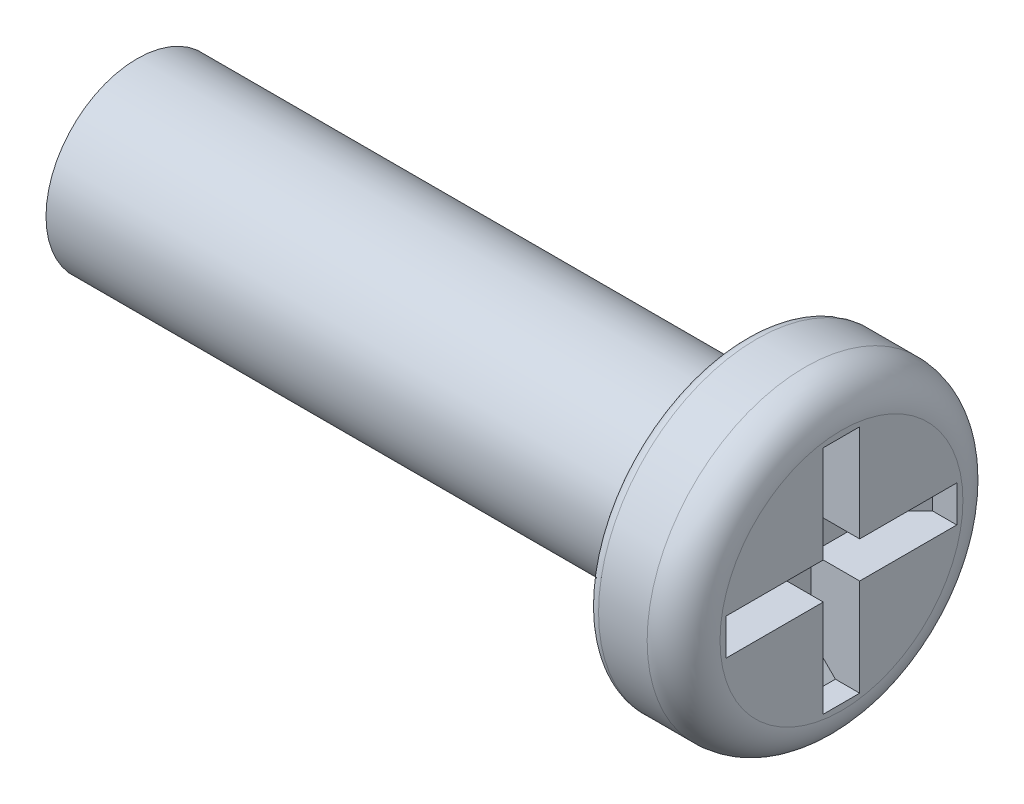
ISO-10303-21;
HEADER;
FILE_DESCRIPTION(('STEP AP214'),'2;1');
FILE_NAME('part.step','',(''),(''),'','','');
FILE_SCHEMA(('AUTOMOTIVE_DESIGN { 1 0 10303 214 1 1 1 1 }'));
ENDSEC;
DATA;
#1=APPLICATION_CONTEXT('core data for automotive mechanical design processes');
#2=APPLICATION_PROTOCOL_DEFINITION('international standard','automotive_design',2000,#1);
#3=PRODUCT_CONTEXT('',#1,'mechanical');
#4=PRODUCT('Part','Part','',(#3));
#5=PRODUCT_RELATED_PRODUCT_CATEGORY('part','',(#4));
#6=PRODUCT_DEFINITION_FORMATION('','',#4);
#7=PRODUCT_DEFINITION_CONTEXT('part definition',#1,'design');
#8=PRODUCT_DEFINITION('design','',#6,#7);
#9=PRODUCT_DEFINITION_SHAPE('','',#8);
#10=(LENGTH_UNIT() NAMED_UNIT(*) SI_UNIT(.MILLI.,.METRE.));
#11=(NAMED_UNIT(*) PLANE_ANGLE_UNIT() SI_UNIT($,.RADIAN.));
#12=(NAMED_UNIT(*) SI_UNIT($,.STERADIAN.) SOLID_ANGLE_UNIT());
#13=UNCERTAINTY_MEASURE_WITH_UNIT(LENGTH_MEASURE(1.E-05),#10,'distance_accuracy_value','');
#14=(GEOMETRIC_REPRESENTATION_CONTEXT(3) GLOBAL_UNCERTAINTY_ASSIGNED_CONTEXT((#13)) GLOBAL_UNIT_ASSIGNED_CONTEXT((#10,
#11,#12)) REPRESENTATION_CONTEXT('',''));
#15=CARTESIAN_POINT('',(0.,0.,0.));
#16=DIRECTION('',(0.,0.,1.));
#17=DIRECTION('',(1.,0.,0.));
#18=AXIS2_PLACEMENT_3D('',#15,#16,#17);
#19=CARTESIAN_POINT('',(-10.8,0.,0.));
#20=DIRECTION('',(1.,0.,0.));
#21=DIRECTION('',(0.,-1.,0.));
#22=AXIS2_PLACEMENT_3D('',#19,#20,#21);
#23=PLANE('',#22);
#24=CARTESIAN_POINT('',(-10.8,0.,0.));
#25=DIRECTION('',(1.,0.,0.));
#26=DIRECTION('',(0.,0.,-1.));
#27=AXIS2_PLACEMENT_3D('',#24,#25,#26);
#28=CIRCLE('',#27,1.5);
#29=CARTESIAN_POINT('',(-10.8,0.,-1.5));
#30=VERTEX_POINT('',#29);
#31=EDGE_CURVE('E11',#30,#30,#28,.T.);
#32=ORIENTED_EDGE('',*,*,#31,.F.);
#33=EDGE_LOOP('',(#32));
#34=FACE_BOUND('',#33,.T.);
#35=ADVANCED_FACE('F17',(#34),#23,.F.);
#36=CARTESIAN_POINT('',(-10.8,0.,0.));
#37=DIRECTION('',(1.,0.,0.));
#38=DIRECTION('',(0.,1.,0.));
#39=AXIS2_PLACEMENT_3D('',#36,#37,#38);
#40=CYLINDRICAL_SURFACE('',#39,1.5);
#41=CARTESIAN_POINT('',(-0.8,0.,0.));
#42=DIRECTION('',(-1.,0.,0.));
#43=DIRECTION('',(0.,-1.,0.));
#44=AXIS2_PLACEMENT_3D('',#41,#42,#43);
#45=CIRCLE('',#44,1.5);
#46=CARTESIAN_POINT('',(-0.8,-1.5,0.));
#47=VERTEX_POINT('',#46);
#48=EDGE_CURVE('E222',#47,#47,#45,.T.);
#49=ORIENTED_EDGE('',*,*,#48,.T.);
#50=EDGE_LOOP('',(#49));
#51=FACE_BOUND('',#50,.T.);
#52=ORIENTED_EDGE('',*,*,#31,.T.);
#53=EDGE_LOOP('',(#52));
#54=FACE_BOUND('',#53,.T.);
#55=ADVANCED_FACE('F19',(#51,#54),#40,.T.);
#56=CARTESIAN_POINT('',(-0.6,0.,0.));
#57=DIRECTION('',(-1.,0.,0.));
#58=DIRECTION('',(0.,-1.,0.));
#59=AXIS2_PLACEMENT_3D('',#56,#57,#58);
#60=TOROIDAL_SURFACE('',#59,2.4,0.2);
#61=CARTESIAN_POINT('',(-0.8,0.,0.));
#62=DIRECTION('',(-1.,0.,0.));
#63=DIRECTION('',(0.,-1.,0.));
#64=AXIS2_PLACEMENT_3D('',#61,#62,#63);
#65=CIRCLE('',#64,2.4);
#66=CARTESIAN_POINT('',(-0.8,-2.4,0.));
#67=VERTEX_POINT('',#66);
#68=EDGE_CURVE('E226',#67,#67,#65,.T.);
#69=ORIENTED_EDGE('',*,*,#68,.F.);
#70=EDGE_LOOP('',(#69));
#71=FACE_BOUND('',#70,.T.);
#72=CARTESIAN_POINT('',(-0.6,0.,0.));
#73=DIRECTION('',(1.,0.,0.));
#74=DIRECTION('',(0.,-1.,0.));
#75=AXIS2_PLACEMENT_3D('',#72,#73,#74);
#76=CIRCLE('',#75,2.6);
#77=CARTESIAN_POINT('',(-0.6,-2.6,0.));
#78=VERTEX_POINT('',#77);
#79=EDGE_CURVE('E237',#78,#78,#76,.T.);
#80=ORIENTED_EDGE('',*,*,#79,.F.);
#81=EDGE_LOOP('',(#80));
#82=FACE_BOUND('',#81,.T.);
#83=ADVANCED_FACE('F446',(#71,#82),#60,.T.);
#84=CARTESIAN_POINT('',(0.,0.,1.49888982286336));
#85=DIRECTION('',(-0.707106781186548,0.,0.707106781186548));
#86=DIRECTION('',(0.,1.,0.));
#87=AXIS2_PLACEMENT_3D('',#84,#85,#86);
#88=PLANE('',#87);
#89=DIRECTION('',(-0.707106781186548,0.,-0.707106781186548));
#90=VECTOR('',#89,1.);
#91=CARTESIAN_POINT('',(0.175218670547079,0.3,1.67410849341044));
#92=LINE('',#91,#90);
#93=CARTESIAN_POINT('',(0.4,0.3,1.89888982286336));
#94=VERTEX_POINT('',#93);
#95=CARTESIAN_POINT('',(0.,0.3,1.49888982286336));
#96=VERTEX_POINT('',#95);
#97=EDGE_CURVE('E298',#94,#96,#92,.T.);
#98=ORIENTED_EDGE('',*,*,#97,.F.);
#99=DIRECTION('',(0.,1.,0.));
#100=VECTOR('',#99,1.);
#101=CARTESIAN_POINT('',(0.4,0.3,1.89888982286336));
#102=LINE('',#101,#100);
#103=CARTESIAN_POINT('',(0.4,-0.3,1.89888982286336));
#104=VERTEX_POINT('',#103);
#105=EDGE_CURVE('E346',#104,#94,#102,.T.);
#106=ORIENTED_EDGE('',*,*,#105,.F.);
#107=DIRECTION('',(0.707106781186548,0.,0.707106781186548));
#108=VECTOR('',#107,1.);
#109=CARTESIAN_POINT('',(0.974663581978759,-0.3,2.47355340484212));
#110=LINE('',#109,#108);
#111=CARTESIAN_POINT('',(0.,-0.3,1.49888982286336));
#112=VERTEX_POINT('',#111);
#113=EDGE_CURVE('E269',#112,#104,#110,.T.);
#114=ORIENTED_EDGE('',*,*,#113,.F.);
#115=DIRECTION('',(0.,-1.,0.));
#116=VECTOR('',#115,1.);
#117=CARTESIAN_POINT('',(0.,0.,1.49888982286336));
#118=LINE('',#117,#116);
#119=EDGE_CURVE('E326',#96,#112,#118,.T.);
#120=ORIENTED_EDGE('',*,*,#119,.F.);
#121=EDGE_LOOP('',(#98,#106,#114,#120));
#122=FACE_BOUND('',#121,.T.);
#123=ADVANCED_FACE('F383',(#122),#88,.F.);
#124=CARTESIAN_POINT('',(0.,-1.5,0.));
#125=DIRECTION('',(-0.707106781186548,-0.707106781186547,0.));
#126=DIRECTION('',(-0.707106781186547,0.707106781186548,0.));
#127=AXIS2_PLACEMENT_3D('',#124,#125,#126);
#128=PLANE('',#127);
#129=DIRECTION('',(-0.707106781186547,0.707106781186548,0.));
#130=VECTOR('',#129,1.);
#131=CARTESIAN_POINT('',(0.174663581978759,-1.67466358197876,0.3));
#132=LINE('',#131,#130);
#133=CARTESIAN_POINT('',(0.4,-1.9,0.3));
#134=VERTEX_POINT('',#133);
#135=CARTESIAN_POINT('',(0.,-1.5,0.3));
#136=VERTEX_POINT('',#135);
#137=EDGE_CURVE('E321',#134,#136,#132,.T.);
#138=ORIENTED_EDGE('',*,*,#137,.F.);
#139=DIRECTION('',(0.,0.,1.));
#140=VECTOR('',#139,1.);
#141=CARTESIAN_POINT('',(0.4,-1.9,0.3));
#142=LINE('',#141,#140);
#143=CARTESIAN_POINT('',(0.4,-1.9,-0.3));
#144=VERTEX_POINT('',#143);
#145=EDGE_CURVE('E48',#144,#134,#142,.T.);
#146=ORIENTED_EDGE('',*,*,#145,.F.);
#147=DIRECTION('',(0.707106781186547,-0.707106781186548,0.));
#148=VECTOR('',#147,1.);
#149=CARTESIAN_POINT('',(0.974663581978759,-2.47466358197876,-0.3));
#150=LINE('',#149,#148);
#151=CARTESIAN_POINT('',(0.,-1.5,-0.3));
#152=VERTEX_POINT('',#151);
#153=EDGE_CURVE('E176',#152,#144,#150,.T.);
#154=ORIENTED_EDGE('',*,*,#153,.F.);
#155=DIRECTION('',(0.,0.,-1.));
#156=VECTOR('',#155,1.);
#157=CARTESIAN_POINT('',(0.,-1.5,0.));
#158=LINE('',#157,#156);
#159=EDGE_CURVE('E21',#136,#152,#158,.T.);
#160=ORIENTED_EDGE('',*,*,#159,.F.);
#161=EDGE_LOOP('',(#138,#146,#154,#160));
#162=FACE_BOUND('',#161,.T.);
#163=ADVANCED_FACE('F391',(#162),#128,.F.);
#164=CARTESIAN_POINT('',(0.,1.5,0.));
#165=DIRECTION('',(-0.707106781186547,0.707106781186548,0.));
#166=DIRECTION('',(0.,0.,1.));
#167=AXIS2_PLACEMENT_3D('',#164,#165,#166);
#168=PLANE('',#167);
#169=DIRECTION('',(-0.707106781186548,-0.707106781186547,0.));
#170=VECTOR('',#169,1.);
#171=CARTESIAN_POINT('',(0.174663581978759,1.67466358197876,-0.3));
#172=LINE('',#171,#170);
#173=CARTESIAN_POINT('',(0.4,1.9,-0.3));
#174=VERTEX_POINT('',#173);
#175=CARTESIAN_POINT('',(0.,1.5,-0.3));
#176=VERTEX_POINT('',#175);
#177=EDGE_CURVE('E297',#174,#176,#172,.T.);
#178=ORIENTED_EDGE('',*,*,#177,.F.);
#179=DIRECTION('',(0.,0.,-1.));
#180=VECTOR('',#179,1.);
#181=CARTESIAN_POINT('',(0.4,1.9,-0.3));
#182=LINE('',#181,#180);
#183=CARTESIAN_POINT('',(0.4,1.9,0.3));
#184=VERTEX_POINT('',#183);
#185=EDGE_CURVE('E315',#184,#174,#182,.T.);
#186=ORIENTED_EDGE('',*,*,#185,.F.);
#187=DIRECTION('',(0.707106781186548,0.707106781186547,0.));
#188=VECTOR('',#187,1.);
#189=CARTESIAN_POINT('',(0.974663581978759,2.47466358197876,0.3));
#190=LINE('',#189,#188);
#191=CARTESIAN_POINT('',(0.,1.5,0.3));
#192=VERTEX_POINT('',#191);
#193=EDGE_CURVE('E325',#192,#184,#190,.T.);
#194=ORIENTED_EDGE('',*,*,#193,.F.);
#195=DIRECTION('',(0.,0.,1.));
#196=VECTOR('',#195,1.);
#197=CARTESIAN_POINT('',(0.,1.5,0.));
#198=LINE('',#197,#196);
#199=EDGE_CURVE('E329',#176,#192,#198,.T.);
#200=ORIENTED_EDGE('',*,*,#199,.F.);
#201=EDGE_LOOP('',(#178,#186,#194,#200));
#202=FACE_BOUND('',#201,.T.);
#203=ADVANCED_FACE('F370',(#202),#168,.F.);
#204=CARTESIAN_POINT('',(0.,0.,-1.49888982286336));
#205=DIRECTION('',(-0.707106781186548,0.,-0.707106781186548));
#206=DIRECTION('',(-0.707106781186548,0.,0.707106781186548));
#207=AXIS2_PLACEMENT_3D('',#204,#205,#206);
#208=PLANE('',#207);
#209=DIRECTION('',(-0.707106781186548,0.,0.707106781186548));
#210=VECTOR('',#209,1.);
#211=CARTESIAN_POINT('',(0.175218670547079,-0.3,-1.67410849341044));
#212=LINE('',#211,#210);
#213=CARTESIAN_POINT('',(0.4,-0.3,-1.89888982286336));
#214=VERTEX_POINT('',#213);
#215=CARTESIAN_POINT('',(0.,-0.3,-1.49888982286336));
#216=VERTEX_POINT('',#215);
#217=EDGE_CURVE('E278',#214,#216,#212,.T.);
#218=ORIENTED_EDGE('',*,*,#217,.F.);
#219=DIRECTION('',(0.,-1.,0.));
#220=VECTOR('',#219,1.);
#221=CARTESIAN_POINT('',(0.4,-0.3,-1.89888982286336));
#222=LINE('',#221,#220);
#223=CARTESIAN_POINT('',(0.4,0.3,-1.89888982286336));
#224=VERTEX_POINT('',#223);
#225=EDGE_CURVE('E253',#224,#214,#222,.T.);
#226=ORIENTED_EDGE('',*,*,#225,.F.);
#227=DIRECTION('',(0.707106781186548,0.,-0.707106781186548));
#228=VECTOR('',#227,1.);
#229=CARTESIAN_POINT('',(0.974663581978759,0.3,-2.47355340484212));
#230=LINE('',#229,#228);
#231=CARTESIAN_POINT('',(0.,0.3,-1.49888982286336));
#232=VERTEX_POINT('',#231);
#233=EDGE_CURVE('E248',#232,#224,#230,.T.);
#234=ORIENTED_EDGE('',*,*,#233,.F.);
#235=DIRECTION('',(0.,1.,0.));
#236=VECTOR('',#235,1.);
#237=CARTESIAN_POINT('',(0.,0.,-1.49888982286336));
#238=LINE('',#237,#236);
#239=EDGE_CURVE('E287',#216,#232,#238,.T.);
#240=ORIENTED_EDGE('',*,*,#239,.F.);
#241=EDGE_LOOP('',(#218,#226,#234,#240));
#242=FACE_BOUND('',#241,.T.);
#243=ADVANCED_FACE('F427',(#242),#208,.F.);
#244=CARTESIAN_POINT('',(0.2,0.,0.));
#245=DIRECTION('',(-1.,0.,0.));
#246=DIRECTION('',(0.,-1.,0.));
#247=AXIS2_PLACEMENT_3D('',#244,#245,#246);
#248=TOROIDAL_SURFACE('',#247,2.,0.6);
#249=CARTESIAN_POINT('',(0.2,0.,0.));
#250=DIRECTION('',(-1.,0.,0.));
#251=DIRECTION('',(0.,-1.,0.));
#252=AXIS2_PLACEMENT_3D('',#249,#250,#251);
#253=CIRCLE('',#252,2.6);
#254=CARTESIAN_POINT('',(0.2,-2.6,0.));
#255=VERTEX_POINT('',#254);
#256=EDGE_CURVE('E227',#255,#255,#253,.T.);
#257=ORIENTED_EDGE('',*,*,#256,.F.);
#258=EDGE_LOOP('',(#257));
#259=FACE_BOUND('',#258,.T.);
#260=CARTESIAN_POINT('',(0.8,0.,0.));
#261=DIRECTION('',(1.,0.,0.));
#262=DIRECTION('',(0.,-1.,0.));
#263=AXIS2_PLACEMENT_3D('',#260,#261,#262);
#264=CIRCLE('',#263,2.);
#265=CARTESIAN_POINT('',(0.8,-2.,0.));
#266=VERTEX_POINT('',#265);
#267=EDGE_CURVE('E198',#266,#266,#264,.T.);
#268=ORIENTED_EDGE('',*,*,#267,.F.);
#269=EDGE_LOOP('',(#268));
#270=FACE_BOUND('',#269,.T.);
#271=ADVANCED_FACE('F459',(#259,#270),#248,.T.);
#272=CARTESIAN_POINT('',(0.,0.,0.));
#273=DIRECTION('',(-1.,0.,0.));
#274=DIRECTION('',(0.,0.,1.));
#275=AXIS2_PLACEMENT_3D('',#272,#273,#274);
#276=PLANE('',#275);
#277=DIRECTION('',(0.,0.,-1.));
#278=VECTOR('',#277,1.);
#279=CARTESIAN_POINT('',(0.,-0.3,-0.3));
#280=LINE('',#279,#278);
#281=CARTESIAN_POINT('',(0.,-0.3,-0.3));
#282=VERTEX_POINT('',#281);
#283=EDGE_CURVE('E254',#282,#216,#280,.T.);
#284=ORIENTED_EDGE('',*,*,#283,.T.);
#285=ORIENTED_EDGE('',*,*,#239,.T.);
#286=DIRECTION('',(0.,0.,1.));
#287=VECTOR('',#286,1.);
#288=CARTESIAN_POINT('',(0.,0.3,-1.89888982286336));
#289=LINE('',#288,#287);
#290=CARTESIAN_POINT('',(0.,0.3,-0.3));
#291=VERTEX_POINT('',#290);
#292=EDGE_CURVE('E283',#232,#291,#289,.T.);
#293=ORIENTED_EDGE('',*,*,#292,.T.);
#294=DIRECTION('',(0.,1.,0.));
#295=VECTOR('',#294,1.);
#296=CARTESIAN_POINT('',(0.,0.3,-0.3));
#297=LINE('',#296,#295);
#298=EDGE_CURVE('E307',#291,#176,#297,.T.);
#299=ORIENTED_EDGE('',*,*,#298,.T.);
#300=ORIENTED_EDGE('',*,*,#199,.T.);
#301=DIRECTION('',(0.,-1.,0.));
#302=VECTOR('',#301,1.);
#303=CARTESIAN_POINT('',(0.,1.9,0.3));
#304=LINE('',#303,#302);
#305=CARTESIAN_POINT('',(0.,0.3,0.3));
#306=VERTEX_POINT('',#305);
#307=EDGE_CURVE('E318',#192,#306,#304,.T.);
#308=ORIENTED_EDGE('',*,*,#307,.T.);
#309=DIRECTION('',(0.,0.,1.));
#310=VECTOR('',#309,1.);
#311=CARTESIAN_POINT('',(0.,0.3,0.3));
#312=LINE('',#311,#310);
#313=EDGE_CURVE('E302',#306,#96,#312,.T.);
#314=ORIENTED_EDGE('',*,*,#313,.T.);
#315=ORIENTED_EDGE('',*,*,#119,.T.);
#316=DIRECTION('',(0.,0.,-1.));
#317=VECTOR('',#316,1.);
#318=CARTESIAN_POINT('',(0.,-0.3,1.89888982286336));
#319=LINE('',#318,#317);
#320=CARTESIAN_POINT('',(0.,-0.3,0.3));
#321=VERTEX_POINT('',#320);
#322=EDGE_CURVE('E349',#112,#321,#319,.T.);
#323=ORIENTED_EDGE('',*,*,#322,.T.);
#324=DIRECTION('',(0.,-1.,0.));
#325=VECTOR('',#324,1.);
#326=CARTESIAN_POINT('',(0.,-0.3,0.3));
#327=LINE('',#326,#325);
#328=EDGE_CURVE('E288',#321,#136,#327,.T.);
#329=ORIENTED_EDGE('',*,*,#328,.T.);
#330=ORIENTED_EDGE('',*,*,#159,.T.);
#331=DIRECTION('',(0.,1.,0.));
#332=VECTOR('',#331,1.);
#333=CARTESIAN_POINT('',(0.,-1.9,-0.3));
#334=LINE('',#333,#332);
#335=EDGE_CURVE('E261',#152,#282,#334,.T.);
#336=ORIENTED_EDGE('',*,*,#335,.T.);
#337=EDGE_LOOP('',(#284,#285,#293,#299,#300,#308,#314,#315,#323,#329,#330,#336));
#338=FACE_BOUND('',#337,.T.);
#339=ADVANCED_FACE('F365',(#338),#276,.F.);
#340=CARTESIAN_POINT('',(1.54932716395752,-1.9,0.3));
#341=DIRECTION('',(0.,1.,0.));
#342=DIRECTION('',(1.,0.,0.));
#343=AXIS2_PLACEMENT_3D('',#340,#341,#342);
#344=PLANE('',#343);
#345=DIRECTION('',(-1.,0.,0.));
#346=VECTOR('',#345,1.);
#347=CARTESIAN_POINT('',(1.54932716395752,-1.9,-0.3));
#348=LINE('',#347,#346);
#349=CARTESIAN_POINT('',(0.8,-1.9,-0.3));
#350=VERTEX_POINT('',#349);
#351=EDGE_CURVE('E169',#350,#144,#348,.T.);
#352=ORIENTED_EDGE('',*,*,#351,.T.);
#353=ORIENTED_EDGE('',*,*,#145,.T.);
#354=DIRECTION('',(-1.,0.,0.));
#355=VECTOR('',#354,1.);
#356=CARTESIAN_POINT('',(1.54932716395752,-1.9,0.3));
#357=LINE('',#356,#355);
#358=CARTESIAN_POINT('',(0.8,-1.9,0.3));
#359=VERTEX_POINT('',#358);
#360=EDGE_CURVE('E184',#359,#134,#357,.T.);
#361=ORIENTED_EDGE('',*,*,#360,.F.);
#362=DIRECTION('',(0.,0.,-1.));
#363=VECTOR('',#362,1.);
#364=CARTESIAN_POINT('',(0.8,-1.9,0.));
#365=LINE('',#364,#363);
#366=EDGE_CURVE('E181',#359,#350,#365,.T.);
#367=ORIENTED_EDGE('',*,*,#366,.T.);
#368=EDGE_LOOP('',(#352,#353,#361,#367));
#369=FACE_BOUND('',#368,.T.);
#370=ADVANCED_FACE('F182',(#369),#344,.T.);
#371=CARTESIAN_POINT('',(1.54932716395752,-0.3,0.3));
#372=DIRECTION('',(0.,0.,-1.));
#373=DIRECTION('',(0.,-1.,0.));
#374=AXIS2_PLACEMENT_3D('',#371,#372,#373);
#375=PLANE('',#374);
#376=ORIENTED_EDGE('',*,*,#360,.T.);
#377=ORIENTED_EDGE('',*,*,#137,.T.);
#378=ORIENTED_EDGE('',*,*,#328,.F.);
#379=DIRECTION('',(-1.,0.,0.));
#380=VECTOR('',#379,1.);
#381=CARTESIAN_POINT('',(1.54932716395752,-0.3,0.3));
#382=LINE('',#381,#380);
#383=CARTESIAN_POINT('',(0.8,-0.3,0.3));
#384=VERTEX_POINT('',#383);
#385=EDGE_CURVE('E265',#384,#321,#382,.T.);
#386=ORIENTED_EDGE('',*,*,#385,.F.);
#387=DIRECTION('',(0.,-1.,0.));
#388=VECTOR('',#387,1.);
#389=CARTESIAN_POINT('',(0.8,0.,0.3));
#390=LINE('',#389,#388);
#391=EDGE_CURVE('E189',#384,#359,#390,.T.);
#392=ORIENTED_EDGE('',*,*,#391,.T.);
#393=EDGE_LOOP('',(#376,#377,#378,#386,#392));
#394=FACE_BOUND('',#393,.T.);
#395=ADVANCED_FACE('F389',(#394),#375,.T.);
#396=CARTESIAN_POINT('',(1.54932716395752,-0.3,1.89888982286336));
#397=DIRECTION('',(0.,1.,0.));
#398=DIRECTION('',(1.,0.,0.));
#399=AXIS2_PLACEMENT_3D('',#396,#397,#398);
#400=PLANE('',#399);
#401=ORIENTED_EDGE('',*,*,#322,.F.);
#402=ORIENTED_EDGE('',*,*,#113,.T.);
#403=DIRECTION('',(-1.,0.,0.));
#404=VECTOR('',#403,1.);
#405=CARTESIAN_POINT('',(1.54932716395752,-0.3,1.89888982286336));
#406=LINE('',#405,#404);
#407=CARTESIAN_POINT('',(0.8,-0.3,1.89888982286336));
#408=VERTEX_POINT('',#407);
#409=EDGE_CURVE('E342',#408,#104,#406,.T.);
#410=ORIENTED_EDGE('',*,*,#409,.F.);
#411=DIRECTION('',(0.,0.,-1.));
#412=VECTOR('',#411,1.);
#413=CARTESIAN_POINT('',(0.8,-0.3,0.));
#414=LINE('',#413,#412);
#415=EDGE_CURVE('E213',#408,#384,#414,.T.);
#416=ORIENTED_EDGE('',*,*,#415,.T.);
#417=ORIENTED_EDGE('',*,*,#385,.T.);
#418=EDGE_LOOP('',(#401,#402,#410,#416,#417));
#419=FACE_BOUND('',#418,.T.);
#420=ADVANCED_FACE('F385',(#419),#400,.T.);
#421=CARTESIAN_POINT('',(1.54932716395752,0.3,1.89888982286336));
#422=DIRECTION('',(0.,0.,-1.));
#423=DIRECTION('',(0.,-1.,0.));
#424=AXIS2_PLACEMENT_3D('',#421,#422,#423);
#425=PLANE('',#424);
#426=ORIENTED_EDGE('',*,*,#409,.T.);
#427=ORIENTED_EDGE('',*,*,#105,.T.);
#428=DIRECTION('',(-1.,0.,0.));
#429=VECTOR('',#428,1.);
#430=CARTESIAN_POINT('',(1.54932716395752,0.3,1.89888982286336));
#431=LINE('',#430,#429);
#432=CARTESIAN_POINT('',(0.8,0.3,1.89888982286336));
#433=VERTEX_POINT('',#432);
#434=EDGE_CURVE('E303',#433,#94,#431,.T.);
#435=ORIENTED_EDGE('',*,*,#434,.F.);
#436=DIRECTION('',(0.,-1.,0.));
#437=VECTOR('',#436,1.);
#438=CARTESIAN_POINT('',(0.8,0.,1.89888982286336));
#439=LINE('',#438,#437);
#440=EDGE_CURVE('E208',#433,#408,#439,.T.);
#441=ORIENTED_EDGE('',*,*,#440,.T.);
#442=EDGE_LOOP('',(#426,#427,#435,#441));
#443=FACE_BOUND('',#442,.T.);
#444=ADVANCED_FACE('F497',(#443),#425,.T.);
#445=CARTESIAN_POINT('',(1.54932716395752,0.3,0.3));
#446=DIRECTION('',(0.,-1.,0.));
#447=DIRECTION('',(-1.,0.,0.));
#448=AXIS2_PLACEMENT_3D('',#445,#446,#447);
#449=PLANE('',#448);
#450=ORIENTED_EDGE('',*,*,#434,.T.);
#451=ORIENTED_EDGE('',*,*,#97,.T.);
#452=ORIENTED_EDGE('',*,*,#313,.F.);
#453=DIRECTION('',(-1.,0.,0.));
#454=VECTOR('',#453,1.);
#455=CARTESIAN_POINT('',(1.54932716395752,0.3,0.3));
#456=LINE('',#455,#454);
#457=CARTESIAN_POINT('',(0.8,0.3,0.3));
#458=VERTEX_POINT('',#457);
#459=EDGE_CURVE('E332',#458,#306,#456,.T.);
#460=ORIENTED_EDGE('',*,*,#459,.F.);
#461=DIRECTION('',(0.,0.,1.));
#462=VECTOR('',#461,1.);
#463=CARTESIAN_POINT('',(0.8,0.3,0.));
#464=LINE('',#463,#462);
#465=EDGE_CURVE('E212',#458,#433,#464,.T.);
#466=ORIENTED_EDGE('',*,*,#465,.T.);
#467=EDGE_LOOP('',(#450,#451,#452,#460,#466));
#468=FACE_BOUND('',#467,.T.);
#469=ADVANCED_FACE('F376',(#468),#449,.T.);
#470=CARTESIAN_POINT('',(1.54932716395752,1.9,0.3));
#471=DIRECTION('',(0.,0.,-1.));
#472=DIRECTION('',(0.,-1.,0.));
#473=AXIS2_PLACEMENT_3D('',#470,#471,#472);
#474=PLANE('',#473);
#475=ORIENTED_EDGE('',*,*,#307,.F.);
#476=ORIENTED_EDGE('',*,*,#193,.T.);
#477=DIRECTION('',(-1.,0.,0.));
#478=VECTOR('',#477,1.);
#479=CARTESIAN_POINT('',(1.54932716395752,1.9,0.3));
#480=LINE('',#479,#478);
#481=CARTESIAN_POINT('',(0.8,1.9,0.3));
#482=VERTEX_POINT('',#481);
#483=EDGE_CURVE('E311',#482,#184,#480,.T.);
#484=ORIENTED_EDGE('',*,*,#483,.F.);
#485=DIRECTION('',(0.,-1.,0.));
#486=VECTOR('',#485,1.);
#487=CARTESIAN_POINT('',(0.8,0.,0.3));
#488=LINE('',#487,#486);
#489=EDGE_CURVE('E217',#482,#458,#488,.T.);
#490=ORIENTED_EDGE('',*,*,#489,.T.);
#491=ORIENTED_EDGE('',*,*,#459,.T.);
#492=EDGE_LOOP('',(#475,#476,#484,#490,#491));
#493=FACE_BOUND('',#492,.T.);
#494=ADVANCED_FACE('F372',(#493),#474,.T.);
#495=CARTESIAN_POINT('',(1.54932716395752,1.9,-0.3));
#496=DIRECTION('',(0.,-1.,0.));
#497=DIRECTION('',(0.,0.,-1.));
#498=AXIS2_PLACEMENT_3D('',#495,#496,#497);
#499=PLANE('',#498);
#500=ORIENTED_EDGE('',*,*,#483,.T.);
#501=ORIENTED_EDGE('',*,*,#185,.T.);
#502=DIRECTION('',(-1.,0.,0.));
#503=VECTOR('',#502,1.);
#504=CARTESIAN_POINT('',(1.54932716395752,1.9,-0.3));
#505=LINE('',#504,#503);
#506=CARTESIAN_POINT('',(0.8,1.9,-0.3));
#507=VERTEX_POINT('',#506);
#508=EDGE_CURVE('E247',#507,#174,#505,.T.);
#509=ORIENTED_EDGE('',*,*,#508,.F.);
#510=DIRECTION('',(0.,0.,1.));
#511=VECTOR('',#510,1.);
#512=CARTESIAN_POINT('',(0.8,1.9,0.));
#513=LINE('',#512,#511);
#514=EDGE_CURVE('E221',#507,#482,#513,.T.);
#515=ORIENTED_EDGE('',*,*,#514,.T.);
#516=EDGE_LOOP('',(#500,#501,#509,#515));
#517=FACE_BOUND('',#516,.T.);
#518=ADVANCED_FACE('F421',(#517),#499,.T.);
#519=CARTESIAN_POINT('',(1.54932716395752,0.3,-0.3));
#520=DIRECTION('',(0.,0.,1.));
#521=DIRECTION('',(0.,-1.,0.));
#522=AXIS2_PLACEMENT_3D('',#519,#520,#521);
#523=PLANE('',#522);
#524=ORIENTED_EDGE('',*,*,#508,.T.);
#525=ORIENTED_EDGE('',*,*,#177,.T.);
#526=ORIENTED_EDGE('',*,*,#298,.F.);
#527=DIRECTION('',(-1.,0.,0.));
#528=VECTOR('',#527,1.);
#529=CARTESIAN_POINT('',(1.54932716395752,0.3,-0.3));
#530=LINE('',#529,#528);
#531=CARTESIAN_POINT('',(0.8,0.3,-0.3));
#532=VERTEX_POINT('',#531);
#533=EDGE_CURVE('E243',#532,#291,#530,.T.);
#534=ORIENTED_EDGE('',*,*,#533,.F.);
#535=DIRECTION('',(0.,1.,0.));
#536=VECTOR('',#535,1.);
#537=CARTESIAN_POINT('',(0.8,0.,-0.3));
#538=LINE('',#537,#536);
#539=EDGE_CURVE('E231',#532,#507,#538,.T.);
#540=ORIENTED_EDGE('',*,*,#539,.T.);
#541=EDGE_LOOP('',(#524,#525,#526,#534,#540));
#542=FACE_BOUND('',#541,.T.);
#543=ADVANCED_FACE('F419',(#542),#523,.T.);
#544=CARTESIAN_POINT('',(1.54932716395752,0.3,-1.89888982286336));
#545=DIRECTION('',(0.,-1.,0.));
#546=DIRECTION('',(0.,0.,-1.));
#547=AXIS2_PLACEMENT_3D('',#544,#545,#546);
#548=PLANE('',#547);
#549=ORIENTED_EDGE('',*,*,#292,.F.);
#550=ORIENTED_EDGE('',*,*,#233,.T.);
#551=DIRECTION('',(-1.,0.,0.));
#552=VECTOR('',#551,1.);
#553=CARTESIAN_POINT('',(1.54932716395752,0.3,-1.89888982286336));
#554=LINE('',#553,#552);
#555=CARTESIAN_POINT('',(0.8,0.3,-1.89888982286336));
#556=VERTEX_POINT('',#555);
#557=EDGE_CURVE('E249',#556,#224,#554,.T.);
#558=ORIENTED_EDGE('',*,*,#557,.F.);
#559=DIRECTION('',(0.,0.,1.));
#560=VECTOR('',#559,1.);
#561=CARTESIAN_POINT('',(0.8,0.3,0.));
#562=LINE('',#561,#560);
#563=EDGE_CURVE('E236',#556,#532,#562,.T.);
#564=ORIENTED_EDGE('',*,*,#563,.T.);
#565=ORIENTED_EDGE('',*,*,#533,.T.);
#566=EDGE_LOOP('',(#549,#550,#558,#564,#565));
#567=FACE_BOUND('',#566,.T.);
#568=ADVANCED_FACE('F423',(#567),#548,.T.);
#569=CARTESIAN_POINT('',(1.54932716395752,-0.3,-1.89888982286336));
#570=DIRECTION('',(0.,0.,1.));
#571=DIRECTION('',(1.,0.,0.));
#572=AXIS2_PLACEMENT_3D('',#569,#570,#571);
#573=PLANE('',#572);
#574=ORIENTED_EDGE('',*,*,#557,.T.);
#575=ORIENTED_EDGE('',*,*,#225,.T.);
#576=DIRECTION('',(-1.,0.,0.));
#577=VECTOR('',#576,1.);
#578=CARTESIAN_POINT('',(1.54932716395752,-0.3,-1.89888982286336));
#579=LINE('',#578,#577);
#580=CARTESIAN_POINT('',(0.8,-0.3,-1.89888982286336));
#581=VERTEX_POINT('',#580);
#582=EDGE_CURVE('E274',#581,#214,#579,.T.);
#583=ORIENTED_EDGE('',*,*,#582,.F.);
#584=DIRECTION('',(0.,1.,0.));
#585=VECTOR('',#584,1.);
#586=CARTESIAN_POINT('',(0.8,0.,-1.89888982286336));
#587=LINE('',#586,#585);
#588=EDGE_CURVE('E232',#581,#556,#587,.T.);
#589=ORIENTED_EDGE('',*,*,#588,.T.);
#590=EDGE_LOOP('',(#574,#575,#583,#589));
#591=FACE_BOUND('',#590,.T.);
#592=ADVANCED_FACE('F429',(#591),#573,.T.);
#593=CARTESIAN_POINT('',(1.54932716395752,-0.3,-0.3));
#594=DIRECTION('',(0.,1.,0.));
#595=DIRECTION('',(0.,0.,-1.));
#596=AXIS2_PLACEMENT_3D('',#593,#594,#595);
#597=PLANE('',#596);
#598=ORIENTED_EDGE('',*,*,#582,.T.);
#599=ORIENTED_EDGE('',*,*,#217,.T.);
#600=ORIENTED_EDGE('',*,*,#283,.F.);
#601=DIRECTION('',(-1.,0.,0.));
#602=VECTOR('',#601,1.);
#603=CARTESIAN_POINT('',(1.54932716395752,-0.3,-0.3));
#604=LINE('',#603,#602);
#605=CARTESIAN_POINT('',(0.8,-0.3,-0.3));
#606=VERTEX_POINT('',#605);
#607=EDGE_CURVE('E178',#606,#282,#604,.T.);
#608=ORIENTED_EDGE('',*,*,#607,.F.);
#609=DIRECTION('',(0.,0.,-1.));
#610=VECTOR('',#609,1.);
#611=CARTESIAN_POINT('',(0.8,-0.3,0.));
#612=LINE('',#611,#610);
#613=EDGE_CURVE('E196',#606,#581,#612,.T.);
#614=ORIENTED_EDGE('',*,*,#613,.T.);
#615=EDGE_LOOP('',(#598,#599,#600,#608,#614));
#616=FACE_BOUND('',#615,.T.);
#617=ADVANCED_FACE('F393',(#616),#597,.T.);
#618=CARTESIAN_POINT('',(1.54932716395752,-1.9,-0.3));
#619=DIRECTION('',(0.,0.,1.));
#620=DIRECTION('',(1.,0.,0.));
#621=AXIS2_PLACEMENT_3D('',#618,#619,#620);
#622=PLANE('',#621);
#623=ORIENTED_EDGE('',*,*,#335,.F.);
#624=ORIENTED_EDGE('',*,*,#153,.T.);
#625=ORIENTED_EDGE('',*,*,#351,.F.);
#626=DIRECTION('',(0.,1.,0.));
#627=VECTOR('',#626,1.);
#628=CARTESIAN_POINT('',(0.8,0.,-0.3));
#629=LINE('',#628,#627);
#630=EDGE_CURVE('E175',#350,#606,#629,.T.);
#631=ORIENTED_EDGE('',*,*,#630,.T.);
#632=ORIENTED_EDGE('',*,*,#607,.T.);
#633=EDGE_LOOP('',(#623,#624,#625,#631,#632));
#634=FACE_BOUND('',#633,.T.);
#635=ADVANCED_FACE('F172',(#634),#622,.T.);
#636=CARTESIAN_POINT('',(-0.8,0.,0.));
#637=DIRECTION('',(-1.,0.,0.));
#638=DIRECTION('',(0.,0.,1.));
#639=AXIS2_PLACEMENT_3D('',#636,#637,#638);
#640=PLANE('',#639);
#641=ORIENTED_EDGE('',*,*,#68,.T.);
#642=EDGE_LOOP('',(#641));
#643=FACE_BOUND('',#642,.T.);
#644=ORIENTED_EDGE('',*,*,#48,.F.);
#645=EDGE_LOOP('',(#644));
#646=FACE_BOUND('',#645,.T.);
#647=ADVANCED_FACE('F453',(#643,#646),#640,.T.);
#648=CARTESIAN_POINT('',(0.8,0.,0.));
#649=DIRECTION('',(-1.,0.,0.));
#650=DIRECTION('',(0.,0.,1.));
#651=AXIS2_PLACEMENT_3D('',#648,#649,#650);
#652=CYLINDRICAL_SURFACE('',#651,2.6);
#653=ORIENTED_EDGE('',*,*,#256,.T.);
#654=EDGE_LOOP('',(#653));
#655=FACE_BOUND('',#654,.T.);
#656=ORIENTED_EDGE('',*,*,#79,.T.);
#657=EDGE_LOOP('',(#656));
#658=FACE_BOUND('',#657,.T.);
#659=ADVANCED_FACE('F475',(#655,#658),#652,.T.);
#660=CARTESIAN_POINT('',(0.8,0.,0.));
#661=DIRECTION('',(-1.,0.,0.));
#662=DIRECTION('',(0.,0.,1.));
#663=AXIS2_PLACEMENT_3D('',#660,#661,#662);
#664=PLANE('',#663);
#665=ORIENTED_EDGE('',*,*,#630,.F.);
#666=ORIENTED_EDGE('',*,*,#366,.F.);
#667=ORIENTED_EDGE('',*,*,#391,.F.);
#668=ORIENTED_EDGE('',*,*,#415,.F.);
#669=ORIENTED_EDGE('',*,*,#440,.F.);
#670=ORIENTED_EDGE('',*,*,#465,.F.);
#671=ORIENTED_EDGE('',*,*,#489,.F.);
#672=ORIENTED_EDGE('',*,*,#514,.F.);
#673=ORIENTED_EDGE('',*,*,#539,.F.);
#674=ORIENTED_EDGE('',*,*,#563,.F.);
#675=ORIENTED_EDGE('',*,*,#588,.F.);
#676=ORIENTED_EDGE('',*,*,#613,.F.);
#677=EDGE_LOOP('',(#665,#666,#667,#668,#669,#670,#671,#672,#673,#674,#675,#676));
#678=FACE_BOUND('',#677,.T.);
#679=ORIENTED_EDGE('',*,*,#267,.T.);
#680=EDGE_LOOP('',(#679));
#681=FACE_BOUND('',#680,.T.);
#682=ADVANCED_FACE('F192',(#678,#681),#664,.F.);
#683=CLOSED_SHELL('',(#35,#55,#83,#123,#163,#203,#243,#271,#339,#370,#395,#420,#444,#469,#494,
#518,#543,#568,#592,#617,#635,#647,#659,#682));
#684=MANIFOLD_SOLID_BREP('B1',#683);
#685=ADVANCED_BREP_SHAPE_REPRESENTATION('',(#18,#684),#14);
#686=SHAPE_DEFINITION_REPRESENTATION(#9,#685);
ENDSEC;
END-ISO-10303-21;
